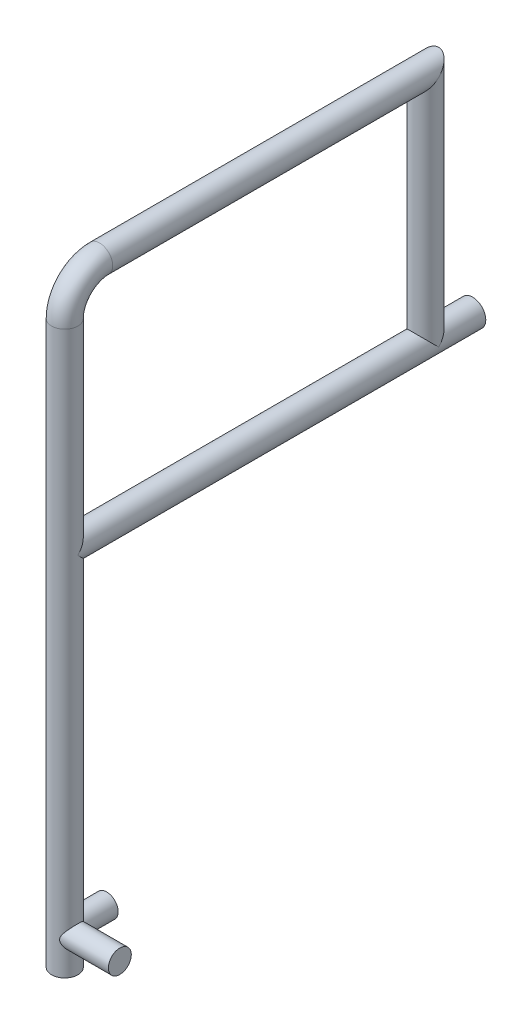
ISO-10303-21;
HEADER;
FILE_DESCRIPTION(('STEP AP214'),'2;1');
FILE_NAME('part.step','',(''),(''),'','','');
FILE_SCHEMA(('AUTOMOTIVE_DESIGN { 1 0 10303 214 1 1 1 1 }'));
ENDSEC;
DATA;
#1=APPLICATION_CONTEXT('core data for automotive mechanical design processes');
#2=APPLICATION_PROTOCOL_DEFINITION('international standard','automotive_design',2000,#1);
#3=PRODUCT_CONTEXT('',#1,'mechanical');
#4=PRODUCT('Part','Part','',(#3));
#5=PRODUCT_RELATED_PRODUCT_CATEGORY('part','',(#4));
#6=PRODUCT_DEFINITION_FORMATION('','',#4);
#7=PRODUCT_DEFINITION_CONTEXT('part definition',#1,'design');
#8=PRODUCT_DEFINITION('design','',#6,#7);
#9=PRODUCT_DEFINITION_SHAPE('','',#8);
#10=(LENGTH_UNIT() NAMED_UNIT(*) SI_UNIT(.MILLI.,.METRE.));
#11=(NAMED_UNIT(*) PLANE_ANGLE_UNIT() SI_UNIT($,.RADIAN.));
#12=(NAMED_UNIT(*) SI_UNIT($,.STERADIAN.) SOLID_ANGLE_UNIT());
#13=UNCERTAINTY_MEASURE_WITH_UNIT(LENGTH_MEASURE(1.E-05),#10,'distance_accuracy_value','');
#14=(GEOMETRIC_REPRESENTATION_CONTEXT(3) GLOBAL_UNCERTAINTY_ASSIGNED_CONTEXT((#13)) GLOBAL_UNIT_ASSIGNED_CONTEXT((#10,
#11,#12)) REPRESENTATION_CONTEXT('',''));
#15=CARTESIAN_POINT('',(0.,0.,0.));
#16=DIRECTION('',(0.,0.,1.));
#17=DIRECTION('',(1.,0.,0.));
#18=AXIS2_PLACEMENT_3D('',#15,#16,#17);
#19=CARTESIAN_POINT('',(0.,0.,0.));
#20=DIRECTION('',(0.,1.,0.));
#21=DIRECTION('',(0.,0.,1.));
#22=AXIS2_PLACEMENT_3D('',#19,#20,#21);
#23=CYLINDRICAL_SURFACE('',#22,20.);
#24=CARTESIAN_POINT('',(0.,0.,0.));
#25=DIRECTION('',(0.,0.707106781186547,0.707106781186547));
#26=DIRECTION('',(0.,0.707106781186547,-0.707106781186547));
#27=AXIS2_PLACEMENT_3D('',#24,#25,#26);
#28=ELLIPSE('',#27,28.2842712474619,20.);
#29=CARTESIAN_POINT('',(-20.,0.,0.));
#30=VERTEX_POINT('',#29);
#31=CARTESIAN_POINT('',(20.,0.,0.));
#32=VERTEX_POINT('',#31);
#33=EDGE_CURVE('E93',#30,#32,#28,.F.);
#34=ORIENTED_EDGE('',*,*,#33,.F.);
#35=CARTESIAN_POINT('',(0.,0.,0.));
#36=DIRECTION('',(0.,0.707106781186547,-0.707106781186547));
#37=DIRECTION('',(0.,0.707106781186547,0.707106781186547));
#38=AXIS2_PLACEMENT_3D('',#35,#36,#37);
#39=ELLIPSE('',#38,28.2842712474619,20.);
#40=EDGE_CURVE('E96',#32,#30,#39,.T.);
#41=ORIENTED_EDGE('',*,*,#40,.F.);
#42=EDGE_LOOP('',(#34,#41));
#43=FACE_BOUND('',#42,.T.);
#44=CARTESIAN_POINT('',(0.,302.819820908144,0.));
#45=DIRECTION('',(0.,1.,0.));
#46=DIRECTION('',(0.,0.,1.));
#47=AXIS2_PLACEMENT_3D('',#44,#45,#46);
#48=CIRCLE('',#47,20.);
#49=CARTESIAN_POINT('',(0.,302.819820908144,20.));
#50=VERTEX_POINT('',#49);
#51=EDGE_CURVE('E163',#50,#50,#48,.T.);
#52=ORIENTED_EDGE('',*,*,#51,.F.);
#53=EDGE_LOOP('',(#52));
#54=FACE_BOUND('',#53,.T.);
#55=CARTESIAN_POINT('',(0.,-553.90605298,0.));
#56=DIRECTION('',(0.,-1.,0.));
#57=DIRECTION('',(0.,0.,-1.));
#58=AXIS2_PLACEMENT_3D('',#55,#56,#57);
#59=CIRCLE('',#58,20.);
#60=CARTESIAN_POINT('',(0.,-553.90605298,-20.));
#61=VERTEX_POINT('',#60);
#62=EDGE_CURVE('E148',#61,#61,#59,.T.);
#63=ORIENTED_EDGE('',*,*,#62,.F.);
#64=EDGE_LOOP('',(#63));
#65=FACE_BOUND('',#64,.T.);
#66=CARTESIAN_POINT('',(17.5,-503.90605298,-9.68245836551851));
#67=CARTESIAN_POINT('',(17.4999987045085,-504.187638009203,-9.68246231795956));
#68=CARTESIAN_POINT('',(17.493183750782,-504.469242415254,-9.69480918943083));
#69=CARTESIAN_POINT('',(17.4661432014171,-505.029712400521,-9.74343813489293));
#70=CARTESIAN_POINT('',(17.4459158352374,-505.308577613209,-9.77972336892797));
#71=CARTESIAN_POINT('',(17.3925802335263,-505.86197922257,-9.87426328854647));
#72=CARTESIAN_POINT('',(17.3594395524864,-506.136502888467,-9.93257330136767));
#73=CARTESIAN_POINT('',(17.2810764516704,-506.679066974342,-10.0682929552098));
#74=CARTESIAN_POINT('',(17.2358485846765,-506.947104411692,-10.1457112063541));
#75=CARTESIAN_POINT('',(17.111615833226,-507.592997294864,-10.3543761638166));
#76=CARTESIAN_POINT('',(17.0265244282843,-507.966884340313,-10.4942738051237));
#77=CARTESIAN_POINT('',(16.835147722142,-508.698873939867,-10.7986160705714));
#78=CARTESIAN_POINT('',(16.7288502054552,-509.05696725036,-10.9630748290121));
#79=CARTESIAN_POINT('',(16.4963517580476,-509.759045089837,-11.3099122851878));
#80=CARTESIAN_POINT('',(16.3700907398646,-510.102982941877,-11.4923444346771));
#81=CARTESIAN_POINT('',(16.0989927963247,-510.776586977339,-11.8691327091975));
#82=CARTESIAN_POINT('',(15.9541574184724,-511.106254346635,-12.0634878401741));
#83=CARTESIAN_POINT('',(15.6780399234265,-511.686154489637,-12.4192960222625));
#84=CARTESIAN_POINT('',(15.5500516306426,-511.938834657242,-12.5793409858103));
#85=CARTESIAN_POINT('',(15.2829019251943,-512.43615073305,-12.902593301777));
#86=CARTESIAN_POINT('',(15.1437394001281,-512.680785836935,-13.0658009678149));
#87=CARTESIAN_POINT('',(14.7095234796256,-513.403209717864,-13.5580665641397));
#88=CARTESIAN_POINT('',(14.3978045379539,-513.869385708831,-13.8896847405041));
#89=CARTESIAN_POINT('',(13.7305135891895,-514.770531463886,-14.5496844312408));
#90=CARTESIAN_POINT('',(13.3749876608545,-515.205533269556,-14.878068960753));
#91=CARTESIAN_POINT('',(12.6194286054934,-516.043516244562,-15.5240744357728));
#92=CARTESIAN_POINT('',(12.2194155138144,-516.446511689313,-15.8417001432422));
#93=CARTESIAN_POINT('',(11.471973798996,-517.128659549576,-16.3876744815375));
#94=CARTESIAN_POINT('',(11.1337109016367,-517.41493070967,-16.619711347584));
#95=CARTESIAN_POINT('',(10.4305290731242,-517.964974479015,-17.0698056319617));
#96=CARTESIAN_POINT('',(10.0656108563211,-518.22874769079,-17.2878634246317));
#97=CARTESIAN_POINT('',(9.30998224050813,-518.73102357124,-17.7062273974091));
#98=CARTESIAN_POINT('',(8.91930810724848,-518.969560590409,-17.9065576451303));
#99=CARTESIAN_POINT('',(8.11259198784244,-519.418914990599,-18.2861816709093));
#100=CARTESIAN_POINT('',(7.69655515376659,-519.629737974048,-18.4654796998659));
#101=CARTESIAN_POINT('',(6.92084465035014,-519.983930199969,-18.7680937292759));
#102=CARTESIAN_POINT('',(6.56519415452404,-520.132539332453,-18.8956068534806));
#103=CARTESIAN_POINT('',(5.83953557962158,-520.407577264458,-19.1323128930905));
#104=CARTESIAN_POINT('',(5.46953046099664,-520.534010608058,-19.2415095615516));
#105=CARTESIAN_POINT('',(4.71701905550149,-520.762930860696,-19.4396771962977));
#106=CARTESIAN_POINT('',(4.33451712566121,-520.865426016367,-19.5286551275904));
#107=CARTESIAN_POINT('',(3.55916144167601,-521.044918001859,-19.6847333854609));
#108=CARTESIAN_POINT('',(3.16630757337979,-521.121914550378,-19.7518334706816));
#109=CARTESIAN_POINT('',(2.37089370722897,-521.249407349046,-19.8630552241249));
#110=CARTESIAN_POINT('',(1.96829309755167,-521.299759973523,-19.9070523449014));
#111=CARTESIAN_POINT('',(1.15863165139275,-521.372385309669,-19.9705396287186));
#112=CARTESIAN_POINT('',(0.751570804832553,-521.394657957872,-19.9900297363705));
#113=CARTESIAN_POINT('',(-0.0634815918557116,-521.410683537615,-20.0040514912821));
#114=CARTESIAN_POINT('',(-0.47147299360347,-521.404440736207,-19.9985868727677));
#115=CARTESIAN_POINT('',(-1.28491619288922,-521.36356740107,-19.9628332349748));
#116=CARTESIAN_POINT('',(-1.69036812413706,-521.328938374831,-19.9325455339593));
#117=CARTESIAN_POINT('',(-2.46102432415985,-521.236111694214,-19.8514602849103));
#118=CARTESIAN_POINT('',(-2.82671325593885,-521.18017473292,-19.8026311439351));
#119=CARTESIAN_POINT('',(-3.55079998638611,-521.045988309111,-19.6856876965186));
#120=CARTESIAN_POINT('',(-3.90919828968454,-520.967740396545,-19.6175747297336));
#121=CARTESIAN_POINT('',(-4.61671283842635,-520.79004039036,-19.4632241291767));
#122=CARTESIAN_POINT('',(-4.96582840116057,-520.690586741965,-19.3769851664396));
#123=CARTESIAN_POINT('',(-5.6530896935226,-520.471760274158,-19.187747148224));
#124=CARTESIAN_POINT('',(-5.99123474502797,-520.352386226193,-19.0847470590451));
#125=CARTESIAN_POINT('',(-6.677823281622,-520.086327834972,-18.8559373813998));
#126=CARTESIAN_POINT('',(-7.02540131475717,-519.938337706903,-18.7290524867205));
#127=CARTESIAN_POINT('',(-7.7053146665914,-519.62287858202,-18.4597362362002));
#128=CARTESIAN_POINT('',(-8.03764972078849,-519.455409247374,-18.3173046107311));
#129=CARTESIAN_POINT('',(-8.68638320773264,-519.102537449897,-18.0187205249017));
#130=CARTESIAN_POINT('',(-9.00277616640983,-518.917128890198,-17.8625634014241));
#131=CARTESIAN_POINT('',(-9.61903985229954,-518.529888376958,-17.5383965882111));
#132=CARTESIAN_POINT('',(-9.91890713869978,-518.328053024697,-17.3703844466224));
#133=CARTESIAN_POINT('',(-10.6524472151174,-517.801075409445,-16.934862683433));
#134=CARTESIAN_POINT('',(-11.0752167304358,-517.466097693799,-16.6607909760938));
#135=CARTESIAN_POINT('',(-11.8818982022432,-516.765146673167,-16.0954431497883));
#136=CARTESIAN_POINT('',(-12.2657920446022,-516.399159063661,-15.8041591099173));
#137=CARTESIAN_POINT('',(-12.9958240083844,-515.637949607916,-15.2095597193116));
#138=CARTESIAN_POINT('',(-13.3418605372674,-515.242653654606,-14.9062148361665));
#139=CARTESIAN_POINT('',(-13.9953365498953,-514.425290322128,-14.2944299438424));
#140=CARTESIAN_POINT('',(-14.3027862373239,-514.003230064983,-13.9859913061423));
#141=CARTESIAN_POINT('',(-14.8388897116663,-513.193614825029,-13.4141221200939));
#142=CARTESIAN_POINT('',(-15.0725463028033,-512.809531032022,-13.1504504526446));
#143=CARTESIAN_POINT('',(-15.5114180261909,-512.020833533775,-12.6297963642774));
#144=CARTESIAN_POINT('',(-15.7166252607194,-511.616214170145,-12.3728158168733));
#145=CARTESIAN_POINT('',(-16.0972148337802,-510.7862851887,-11.8734123320218));
#146=CARTESIAN_POINT('',(-16.2726794391511,-510.361036968866,-11.6309504806044));
#147=CARTESIAN_POINT('',(-16.5927788632844,-509.48691756489,-11.1695243163615));
#148=CARTESIAN_POINT('',(-16.7374405431509,-509.038067391895,-10.950539614174));
#149=CARTESIAN_POINT('',(-16.9333325052445,-508.330672621171,-10.6432351030576));
#150=CARTESIAN_POINT('',(-16.9966377344709,-508.081190694221,-10.5416678184595));
#151=CARTESIAN_POINT('',(-17.1130712677551,-507.5748780262,-10.3515787409943));
#152=CARTESIAN_POINT('',(-17.1661983295665,-507.318046392489,-10.2630585408289));
#153=CARTESIAN_POINT('',(-17.2614241472653,-506.797932264893,-10.1020785938894));
#154=CARTESIAN_POINT('',(-17.3035451687485,-506.534663991926,-10.0295864682285));
#155=CARTESIAN_POINT('',(-17.3760879435573,-506.002169182628,-9.90337736681871));
#156=CARTESIAN_POINT('',(-17.4065160016406,-505.732945940225,-9.84965027453365));
#157=CARTESIAN_POINT('',(-17.4552894705277,-505.186334195269,-9.76296098654505));
#158=CARTESIAN_POINT('',(-17.4734688604364,-504.90888472239,-9.7302843631978));
#159=CARTESIAN_POINT('',(-17.4965474138236,-504.351655489637,-9.68872595593486));
#160=CARTESIAN_POINT('',(-17.5014478969323,-504.07187596409,-9.67984180757338));
#161=CARTESIAN_POINT('',(-17.4978121429926,-503.512641200022,-9.68641226122004));
#162=CARTESIAN_POINT('',(-17.4892733865369,-503.233186032135,-9.7018714267845));
#163=CARTESIAN_POINT('',(-17.4590283498962,-502.677287535776,-9.75619132077277));
#164=CARTESIAN_POINT('',(-17.4373200245495,-502.400844681888,-9.79505568388823));
#165=CARTESIAN_POINT('',(-17.3778033249474,-501.818434768071,-9.90030505749485));
#166=CARTESIAN_POINT('',(-17.3383041208272,-501.513162538779,-9.9695521066519));
#167=CARTESIAN_POINT('',(-17.2445130686978,-500.911109415025,-10.1309144356563));
#168=CARTESIAN_POINT('',(-17.1902178019256,-500.614330500555,-10.2230350001972));
#169=CARTESIAN_POINT('',(-17.0678080717346,-500.029256488622,-10.426121477896));
#170=CARTESIAN_POINT('',(-16.9996516179019,-499.740990292605,-10.5371444826998));
#171=CARTESIAN_POINT('',(-16.8505942445724,-499.173877046099,-10.7739055865237));
#172=CARTESIAN_POINT('',(-16.7696878926591,-498.895034072398,-10.8996499520537));
#173=CARTESIAN_POINT('',(-16.6071825156515,-498.382086952647,-11.145416053778));
#174=CARTESIAN_POINT('',(-16.5270279124971,-498.146862731782,-11.2640727087571));
#175=CARTESIAN_POINT('',(-16.3580751079654,-497.683173317455,-11.508059368069));
#176=CARTESIAN_POINT('',(-16.2692786309489,-497.45470678741,-11.633388038846));
#177=CARTESIAN_POINT('',(-15.990206903609,-496.778541945638,-12.0172011374973));
#178=CARTESIAN_POINT('',(-15.7873351129922,-496.340346132694,-12.2833802803912));
#179=CARTESIAN_POINT('',(-15.3491681676133,-495.486824303244,-12.8267404765425));
#180=CARTESIAN_POINT('',(-15.1138270691918,-495.071531881387,-13.1039367160034));
#181=CARTESIAN_POINT('',(-14.6114321896762,-494.263318815564,-13.6618803280394));
#182=CARTESIAN_POINT('',(-14.3443866679908,-493.870392384259,-13.9426267587902));
#183=CARTESIAN_POINT('',(-13.7569296300854,-493.077453813111,-14.5234398651412));
#184=CARTESIAN_POINT('',(-13.4340017148748,-492.679185307141,-14.8233476898615));
#185=CARTESIAN_POINT('',(-12.7509309998255,-491.909025658326,-15.4148615624592));
#186=CARTESIAN_POINT('',(-12.390781361968,-491.53713938341,-15.7064660723356));
#187=CARTESIAN_POINT('',(-11.6337204129122,-490.822593099614,-16.2751429427536));
#188=CARTESIAN_POINT('',(-11.2368838937112,-490.47987625061,-16.5522431410083));
#189=CARTESIAN_POINT('',(-10.4058480823507,-489.826009453746,-17.0869029944245));
#190=CARTESIAN_POINT('',(-9.97166247275457,-489.514848036043,-17.3444697410039));
#191=CARTESIAN_POINT('',(-9.18304429114012,-489.003632974557,-17.7712631721111));
#192=CARTESIAN_POINT('',(-8.83683781863635,-488.795591906182,-17.9461673608625));
#193=CARTESIAN_POINT('',(-8.12480400602864,-488.401114225544,-18.2795514953357));
#194=CARTESIAN_POINT('',(-7.75898151834497,-488.21467230603,-18.4380354747462));
#195=CARTESIAN_POINT('',(-7.00880756318532,-487.865550544654,-18.7360469717586));
#196=CARTESIAN_POINT('',(-6.62446045355506,-487.702865150101,-18.8755789185479));
#197=CARTESIAN_POINT('',(-5.83876634816055,-487.403461845191,-19.1332092453521));
#198=CARTESIAN_POINT('',(-5.43741906400192,-487.266744375576,-19.2513072615778));
#199=CARTESIAN_POINT('',(-4.61635990334325,-487.020422475996,-19.4646008627409));
#200=CARTESIAN_POINT('',(-4.19651630384067,-486.911070362816,-19.5595831080311));
#201=CARTESIAN_POINT('',(-3.34489411006687,-486.723160751471,-19.7230737390982));
#202=CARTESIAN_POINT('',(-2.91311547263318,-486.64460336469,-19.79158202912));
#203=CARTESIAN_POINT('',(-2.04168403638292,-486.519992411348,-19.9003562197097));
#204=CARTESIAN_POINT('',(-1.60203727520828,-486.473914932689,-19.9406428972317));
#205=CARTESIAN_POINT('',(-0.718839505700273,-486.415225360157,-19.9919694764988));
#206=CARTESIAN_POINT('',(-0.275289047413629,-486.402608624942,-20.0030134345039));
#207=CARTESIAN_POINT('',(0.551522796600775,-486.410537062337,-19.9960767606155));
#208=CARTESIAN_POINT('',(0.934867074390424,-486.426849164909,-19.9818010524998));
#209=CARTESIAN_POINT('',(1.69819663461638,-486.484440536551,-19.9314420569356));
#210=CARTESIAN_POINT('',(2.0781822730498,-486.525717126528,-19.8953611095413));
#211=CARTESIAN_POINT('',(2.83208420729453,-486.632539362997,-19.8021108897347));
#212=CARTESIAN_POINT('',(3.20600043128526,-486.698085296455,-19.744941367967));
#213=CARTESIAN_POINT('',(3.94533820947784,-486.852404302861,-19.6105964335527));
#214=CARTESIAN_POINT('',(4.3107594077774,-486.941178347056,-19.5334201843569));
#215=CARTESIAN_POINT('',(5.02791317002266,-487.139796525061,-19.3611707540315));
#216=CARTESIAN_POINT('',(5.37973649046676,-487.24945270473,-19.2662573524069));
#217=CARTESIAN_POINT('',(6.071334908227,-487.488902880979,-19.0596211609535));
#218=CARTESIAN_POINT('',(6.41111046394941,-487.618696110351,-18.9478990115318));
#219=CARTESIAN_POINT('',(7.07745722468956,-487.896992993497,-18.7092190635449));
#220=CARTESIAN_POINT('',(7.40402541661725,-488.045500885329,-18.5822578142969));
#221=CARTESIAN_POINT('',(8.04301328355594,-488.359774680367,-18.3147474221613));
#222=CARTESIAN_POINT('',(8.35543003122139,-488.525544131089,-18.1741954866046));
#223=CARTESIAN_POINT('',(9.10397436245988,-488.951853016445,-17.8145907293151));
#224=CARTESIAN_POINT('',(9.53188835109631,-489.221255785161,-17.5888636641035));
#225=CARTESIAN_POINT('',(10.3554405658836,-489.789910108647,-17.1169593153222));
#226=CARTESIAN_POINT('',(10.7510661578432,-490.089173246706,-16.8707741019663));
#227=CARTESIAN_POINT('',(11.5104422744364,-490.715058983897,-16.3621198901789));
#228=CARTESIAN_POINT('',(11.8741247202074,-491.04173724824,-16.0996180560313));
#229=CARTESIAN_POINT('',(12.5687624660778,-491.719515113706,-15.5633771594029));
#230=CARTESIAN_POINT('',(12.8997218406325,-492.070611665131,-15.2896395019523));
#231=CARTESIAN_POINT('',(13.5356508566244,-492.803073109048,-14.72987316462));
#232=CARTESIAN_POINT('',(13.8399592593223,-493.184906651098,-14.4437078646564));
#233=CARTESIAN_POINT('',(14.4152330038578,-493.971834141318,-13.8696125016716));
#234=CARTESIAN_POINT('',(14.6861907790018,-494.376933337607,-13.5816820536672));
#235=CARTESIAN_POINT('',(15.1943805053081,-495.210149718194,-13.010637513981));
#236=CARTESIAN_POINT('',(15.4316500572476,-495.638240492993,-12.7275183680389));
#237=CARTESIAN_POINT('',(15.8721719066567,-496.519130386944,-12.1737010959011));
#238=CARTESIAN_POINT('',(16.0754421095446,-496.971916332954,-11.9029964865827));
#239=CARTESIAN_POINT('',(16.3687173904552,-497.709276540424,-11.49345720717));
#240=CARTESIAN_POINT('',(16.4705088954274,-497.98489421638,-11.3468698043643));
#241=CARTESIAN_POINT('',(16.6615061443608,-498.545829762428,-11.0645018507486));
#242=CARTESIAN_POINT('',(16.7507152785887,-498.831144993743,-10.9287183931755));
#243=CARTESIAN_POINT('',(16.9156795216673,-499.411537715271,-10.6716024645333));
#244=CARTESIAN_POINT('',(16.9914536680585,-499.706600677473,-10.5502496267717));
#245=CARTESIAN_POINT('',(17.1286628505161,-500.306938183144,-10.3259964141428));
#246=CARTESIAN_POINT('',(17.1901019079224,-500.612209835287,-10.2230908662448));
#247=CARTESIAN_POINT('',(17.2853099639157,-501.16242940612,-10.0610540433444));
#248=CARTESIAN_POINT('',(17.3221943738273,-501.40546889127,-9.9972840458887));
#249=CARTESIAN_POINT('',(17.3859968639091,-501.896486181039,-9.88591139744385));
#250=CARTESIAN_POINT('',(17.412918062394,-502.144462414889,-9.83830368832163));
#251=CARTESIAN_POINT('',(17.4562054479926,-502.64370143014,-9.76129389812739));
#252=CARTESIAN_POINT('',(17.4725911158864,-502.894957264168,-9.73185822000438));
#253=CARTESIAN_POINT('',(17.4944891931898,-503.399487778813,-9.69243828492371));
#254=CARTESIAN_POINT('',(17.5000011653163,-503.652762540209,-9.68245481023173));
#255=CARTESIAN_POINT('',(17.5,-503.90605298,-9.68245836551851));
#256=B_SPLINE_CURVE_WITH_KNOTS('',3,(#66,#67,#68,#69,#70,#71,#72,#73,#74,#75,#76,#77,#78,#79,
#80,#81,#82,#83,#84,#85,#86,#87,#88,#89,#90,#91,#92,#93,#94,#95,#96,#97,#98,#99,#100,#101,#102,
#103,#104,#105,#106,#107,#108,#109,#110,#111,#112,#113,#114,#115,#116,#117,#118,#119,#120,#121,
#122,#123,#124,#125,#126,#127,#128,#129,#130,#131,#132,#133,#134,#135,#136,#137,#138,#139,#140,
#141,#142,#143,#144,#145,#146,#147,#148,#149,#150,#151,#152,#153,#154,#155,#156,#157,#158,#159,
#160,#161,#162,#163,#164,#165,#166,#167,#168,#169,#170,#171,#172,#173,#174,#175,#176,#177,#178,
#179,#180,#181,#182,#183,#184,#185,#186,#187,#188,#189,#190,#191,#192,#193,#194,#195,#196,#197,
#198,#199,#200,#201,#202,#203,#204,#205,#206,#207,#208,#209,#210,#211,#212,#213,#214,#215,#216,
#217,#218,#219,#220,#221,#222,#223,#224,#225,#226,#227,#228,#229,#230,#231,#232,#233,#234,#235,
#236,#237,#238,#239,#240,#241,#242,#243,#244,#245,#246,#247,#248,#249,#250,#251,#252,#253,#254,
#255),.UNSPECIFIED.,.T.,.F.,(4,2,2,2,2,2,2,2,2,2,2,2,2,2,2,2,2,2,2,2,2,2,2,2,2,2,2,2,2,2,2,2,2,
2,2,2,2,2,2,2,2,2,2,2,2,2,2,2,2,2,2,2,2,2,2,2,2,2,2,2,2,2,2,2,2,2,2,2,2,2,2,2,2,2,2,2,2,2,2,2,2,
2,2,2,2,2,2,2,2,2,2,2,2,2,4),(0.,0.844447348855804,1.68900619343504,2.53570087187167,
3.38277776751629,4.60521386836723,5.82835618043759,7.05525263874213,8.28204694569044,
9.25773598830623,10.2335222820803,12.1855950795112,14.1356318252152,16.0847938770524,
17.5841768963533,19.0835197476246,20.5807947596339,22.0777666285752,23.2945832448506,
24.5111502290909,25.7272974894221,26.9434581658806,28.1661095116172,29.3887636206883,
30.6112347777573,31.8336410180615,32.95184546631,34.069972251428,35.1881810441921,
36.3064588258382,37.500847223771,38.6952563393504,39.8900728251208,41.085137151123,
42.8975713540968,44.7108462126302,46.5288735543442,48.3464191298368,49.9088676293691,
51.4717490096991,53.030234375123,54.5873550762648,55.416987035205,56.2467201863972,
57.0747615303507,57.9023557721026,58.7409531185224,59.5794671238206,60.4181383411355,
61.2569398328303,62.2019727672853,63.1472242454998,64.0953830575369,65.0439469543564,
65.8697638349125,66.6954162721954,68.3476501697795,70.0022464038743,71.6564125363883,
73.4366906864781,75.2172964755623,76.9943490678951,78.7707534002672,80.0900636738466,
81.409049081404,82.727725702949,84.046424703755,85.376868218913,86.707316546183,
88.0367843555127,89.3660677445915,90.5165163740823,91.6668415637832,92.8171803555992,
93.9675672547518,95.1080513760503,96.2484920563186,97.3891914624534,98.5301257642416,
100.188931696167,101.848383624288,103.511290533535,105.173990127436,106.870326993518,
108.567048023084,110.261860131013,111.955776853396,112.940377948194,113.924713237479,
114.907642366028,115.890295426722,116.651508996311,117.412484117202,118.172048075373,
118.931642578596),.UNSPECIFIED.);
#257=CARTESIAN_POINT('',(14.1421356237309,-514.213817044044,-14.142135623731));
#258=VERTEX_POINT('',#257);
#259=CARTESIAN_POINT('',(14.142135623731,-493.598288915956,-14.1421356237309));
#260=VERTEX_POINT('',#259);
#261=EDGE_CURVE('E49',#258,#260,#256,.T.);
#262=ORIENTED_EDGE('',*,*,#261,.F.);
#263=CARTESIAN_POINT('',(9.68245836551853,-503.90605298,17.5));
#264=CARTESIAN_POINT('',(9.68246231795958,-503.624467950797,17.4999987045085));
#265=CARTESIAN_POINT('',(9.69480918943084,-503.342863544746,17.493183750782));
#266=CARTESIAN_POINT('',(9.74343813489293,-502.782393559479,17.4661432014171));
#267=CARTESIAN_POINT('',(9.77972336892798,-502.503528346791,17.4459158352374));
#268=CARTESIAN_POINT('',(9.87426328854648,-501.95012673743,17.3925802335263));
#269=CARTESIAN_POINT('',(9.93257330136768,-501.675603071533,17.3594395524864));
#270=CARTESIAN_POINT('',(10.0682929552098,-501.133038985658,17.2810764516704));
#271=CARTESIAN_POINT('',(10.1457112063541,-500.865001548308,17.2358485846765));
#272=CARTESIAN_POINT('',(10.3543761638166,-500.219108665137,17.111615833226));
#273=CARTESIAN_POINT('',(10.4942738051236,-499.845221619687,17.0265244282843));
#274=CARTESIAN_POINT('',(10.7986160705713,-499.113232020133,16.8351477221421));
#275=CARTESIAN_POINT('',(10.9630748290121,-498.75513870964,16.7288502054552));
#276=CARTESIAN_POINT('',(11.3099122851878,-498.053060870163,16.4963517580476));
#277=CARTESIAN_POINT('',(11.492344434677,-497.709123018124,16.3700907398647));
#278=CARTESIAN_POINT('',(11.8691327091973,-497.035518982662,16.0989927963248));
#279=CARTESIAN_POINT('',(12.0634878401739,-496.705851613365,15.9541574184725));
#280=CARTESIAN_POINT('',(12.4192960222624,-496.125951470364,15.6780399234266));
#281=CARTESIAN_POINT('',(12.5793409858102,-495.873271302758,15.5500516306427));
#282=CARTESIAN_POINT('',(12.9025933017769,-495.375955226951,15.2829019251944));
#283=CARTESIAN_POINT('',(13.0658009678148,-495.131320123066,15.1437394001282));
#284=CARTESIAN_POINT('',(13.5580665641396,-494.408896242136,14.7095234796257));
#285=CARTESIAN_POINT('',(13.8896847405039,-493.942720251169,14.397804537954));
#286=CARTESIAN_POINT('',(14.5496844312406,-493.041574496114,13.7305135891896));
#287=CARTESIAN_POINT('',(14.8780689607529,-492.606572690444,13.3749876608546));
#288=CARTESIAN_POINT('',(15.5240744357727,-491.768589715438,12.6194286054936));
#289=CARTESIAN_POINT('',(15.841700143242,-491.365594270688,12.2194155138146));
#290=CARTESIAN_POINT('',(16.3876744815374,-490.683446410424,11.4719737989962));
#291=CARTESIAN_POINT('',(16.6197113475839,-490.39717525033,11.1337109016369));
#292=CARTESIAN_POINT('',(17.0698056319616,-489.847131480985,10.4305290731243));
#293=CARTESIAN_POINT('',(17.2878634246316,-489.58335826921,10.0656108563212));
#294=CARTESIAN_POINT('',(17.706227397409,-489.081082388761,9.30998224050825));
#295=CARTESIAN_POINT('',(17.9065576451303,-488.842545369591,8.91930810724858));
#296=CARTESIAN_POINT('',(18.2861816709093,-488.393190969401,8.11259198784256));
#297=CARTESIAN_POINT('',(18.4654796998659,-488.182367985952,7.69655515376677));
#298=CARTESIAN_POINT('',(18.7680937292758,-487.828175760031,6.92084465035035));
#299=CARTESIAN_POINT('',(18.8956068534805,-487.679566627547,6.56519415452423));
#300=CARTESIAN_POINT('',(19.1323128930904,-487.404528695542,5.83953557962178));
#301=CARTESIAN_POINT('',(19.2415095615515,-487.278095351942,5.46953046099684));
#302=CARTESIAN_POINT('',(19.4396771962977,-487.049175099304,4.71701905550169));
#303=CARTESIAN_POINT('',(19.5286551275903,-486.946679943633,4.33451712566139));
#304=CARTESIAN_POINT('',(19.6847333854608,-486.767187958141,3.55916144167619));
#305=CARTESIAN_POINT('',(19.7518334706815,-486.690191409622,3.16630757337999));
#306=CARTESIAN_POINT('',(19.8630552241249,-486.562698610954,2.3708937072292));
#307=CARTESIAN_POINT('',(19.9070523449014,-486.512345986477,1.96829309755189));
#308=CARTESIAN_POINT('',(19.9705396287186,-486.439720650331,1.15863165139297));
#309=CARTESIAN_POINT('',(19.9900297363705,-486.417448002128,0.751570804832781));
#310=CARTESIAN_POINT('',(20.0040514912821,-486.401422422385,-0.0634815918554822));
#311=CARTESIAN_POINT('',(19.9985868727677,-486.407665223793,-0.471472993603242));
#312=CARTESIAN_POINT('',(19.9628332349748,-486.44853855893,-1.28491619288899));
#313=CARTESIAN_POINT('',(19.9325455339593,-486.483167585169,-1.69036812413683));
#314=CARTESIAN_POINT('',(19.8514602849104,-486.575994265786,-2.46102432415962));
#315=CARTESIAN_POINT('',(19.8026311439351,-486.63193122708,-2.82671325593862));
#316=CARTESIAN_POINT('',(19.6856876965186,-486.766117650889,-3.55079998638588));
#317=CARTESIAN_POINT('',(19.6175747297336,-486.844365563455,-3.90919828968431));
#318=CARTESIAN_POINT('',(19.4632241291768,-487.02206556964,-4.61671283842615));
#319=CARTESIAN_POINT('',(19.3769851664396,-487.121519218035,-4.96582840116039));
#320=CARTESIAN_POINT('',(19.1877471482241,-487.340345685842,-5.65308969352242));
#321=CARTESIAN_POINT('',(19.0847470590452,-487.459719733807,-5.99123474502777));
#322=CARTESIAN_POINT('',(18.8559373813998,-487.725778125028,-6.67782328162176));
#323=CARTESIAN_POINT('',(18.7290524867206,-487.873768253097,-7.02540131475693));
#324=CARTESIAN_POINT('',(18.4597362362003,-488.18922737798,-7.70531466659115));
#325=CARTESIAN_POINT('',(18.3173046107312,-488.356696712626,-8.03764972078823));
#326=CARTESIAN_POINT('',(18.0187205249019,-488.709568510103,-8.68638320773236));
#327=CARTESIAN_POINT('',(17.8625634014243,-488.894977069802,-9.00277616640954));
#328=CARTESIAN_POINT('',(17.5383965882113,-489.282217583042,-9.61903985229929));
#329=CARTESIAN_POINT('',(17.3703844466225,-489.484052935303,-9.91890713869957));
#330=CARTESIAN_POINT('',(16.9348626834331,-490.011030550554,-10.6524472151172));
#331=CARTESIAN_POINT('',(16.660790976094,-490.3460082662,-11.0752167304356));
#332=CARTESIAN_POINT('',(16.0954431497885,-491.046959286833,-11.8818982022429));
#333=CARTESIAN_POINT('',(15.8041591099174,-491.412946896339,-12.265792044602));
#334=CARTESIAN_POINT('',(15.2095597193118,-492.174156352084,-12.9958240083842));
#335=CARTESIAN_POINT('',(14.9062148361667,-492.569452305393,-13.3418605372672));
#336=CARTESIAN_POINT('',(14.2944299438426,-493.386815637872,-13.9953365498951));
#337=CARTESIAN_POINT('',(13.9859913061425,-493.808875895016,-14.3027862373237));
#338=CARTESIAN_POINT('',(13.414122120094,-494.618491134971,-14.8388897116662));
#339=CARTESIAN_POINT('',(13.1504504526447,-495.002574927978,-15.0725463028031));
#340=CARTESIAN_POINT('',(12.6297963642775,-495.791272426225,-15.5114180261908));
#341=CARTESIAN_POINT('',(12.3728158168734,-496.195891789855,-15.7166252607194));
#342=CARTESIAN_POINT('',(11.8734123320219,-497.0258207713,-16.0972148337801));
#343=CARTESIAN_POINT('',(11.6309504806045,-497.451068991134,-16.2726794391511));
#344=CARTESIAN_POINT('',(11.1695243163615,-498.32518839511,-16.5927788632844));
#345=CARTESIAN_POINT('',(10.950539614174,-498.774038568105,-16.7374405431509));
#346=CARTESIAN_POINT('',(10.6432351030576,-499.481433338829,-16.9333325052445));
#347=CARTESIAN_POINT('',(10.5416678184595,-499.73091526578,-16.9966377344709));
#348=CARTESIAN_POINT('',(10.3515787409943,-500.2372279338,-17.1130712677552));
#349=CARTESIAN_POINT('',(10.2630585408289,-500.494059567511,-17.1661983295666));
#350=CARTESIAN_POINT('',(10.1020785938894,-501.014173695107,-17.2614241472653));
#351=CARTESIAN_POINT('',(10.0295864682285,-501.277441968074,-17.3035451687485));
#352=CARTESIAN_POINT('',(9.90337736681871,-501.809936777372,-17.3760879435573));
#353=CARTESIAN_POINT('',(9.84965027453365,-502.079160019775,-17.4065160016406));
#354=CARTESIAN_POINT('',(9.76296098654506,-502.625771764731,-17.4552894705277));
#355=CARTESIAN_POINT('',(9.73028436319781,-502.90322123761,-17.4734688604364));
#356=CARTESIAN_POINT('',(9.68872595593487,-503.460450470363,-17.4965474138236));
#357=CARTESIAN_POINT('',(9.67984180757339,-503.74022999591,-17.5014478969323));
#358=CARTESIAN_POINT('',(9.68641226122005,-504.299464759978,-17.4978121429925));
#359=CARTESIAN_POINT('',(9.7018714267845,-504.578919927865,-17.4892733865369));
#360=CARTESIAN_POINT('',(9.75619132077276,-505.134818424224,-17.4590283498962));
#361=CARTESIAN_POINT('',(9.79505568388822,-505.411261278112,-17.4373200245495));
#362=CARTESIAN_POINT('',(9.90030505749485,-505.993671191929,-17.3778033249474));
#363=CARTESIAN_POINT('',(9.96955210665188,-506.298943421221,-17.3383041208272));
#364=CARTESIAN_POINT('',(10.1309144356563,-506.900996544975,-17.2445130686978));
#365=CARTESIAN_POINT('',(10.2230350001971,-507.197775459445,-17.1902178019256));
#366=CARTESIAN_POINT('',(10.4261214778959,-507.782849471378,-17.0678080717346));
#367=CARTESIAN_POINT('',(10.5371444826997,-508.071115667395,-16.9996516179019));
#368=CARTESIAN_POINT('',(10.7739055865237,-508.638228913901,-16.8505942445724));
#369=CARTESIAN_POINT('',(10.8996499520537,-508.917071887602,-16.7696878926591));
#370=CARTESIAN_POINT('',(11.145416053778,-509.430019007353,-16.6071825156515));
#371=CARTESIAN_POINT('',(11.2640727087571,-509.665243228218,-16.5270279124971));
#372=CARTESIAN_POINT('',(11.508059368069,-510.128932642545,-16.3580751079654));
#373=CARTESIAN_POINT('',(11.633388038846,-510.35739917259,-16.2692786309489));
#374=CARTESIAN_POINT('',(12.0172011374973,-511.033564014362,-15.990206903609));
#375=CARTESIAN_POINT('',(12.2833802803912,-511.471759827306,-15.7873351129922));
#376=CARTESIAN_POINT('',(12.8267404765425,-512.325281656756,-15.3491681676132));
#377=CARTESIAN_POINT('',(13.1039367160034,-512.740574078613,-15.1138270691918));
#378=CARTESIAN_POINT('',(13.6618803280395,-513.548787144436,-14.6114321896762));
#379=CARTESIAN_POINT('',(13.9426267587902,-513.941713575741,-14.3443866679908));
#380=CARTESIAN_POINT('',(14.5234398651412,-514.734652146889,-13.7569296300855));
#381=CARTESIAN_POINT('',(14.8233476898614,-515.132920652859,-13.4340017148748));
#382=CARTESIAN_POINT('',(15.4148615624592,-515.903080301674,-12.7509309998255));
#383=CARTESIAN_POINT('',(15.7064660723356,-516.27496657659,-12.390781361968));
#384=CARTESIAN_POINT('',(16.2751429427536,-516.989512860386,-11.6337204129122));
#385=CARTESIAN_POINT('',(16.5522431410083,-517.33222970939,-11.2368838937112));
#386=CARTESIAN_POINT('',(17.0869029944245,-517.986096506254,-10.4058480823507));
#387=CARTESIAN_POINT('',(17.344469741004,-518.297257923957,-9.97166247275453));
#388=CARTESIAN_POINT('',(17.7712631721112,-518.808472985443,-9.18304429114005));
#389=CARTESIAN_POINT('',(17.9461673608626,-519.016514053818,-8.83683781863627));
#390=CARTESIAN_POINT('',(18.2795514953357,-519.410991734456,-8.12480400602856));
#391=CARTESIAN_POINT('',(18.4380354747463,-519.59743365397,-7.75898151834492));
#392=CARTESIAN_POINT('',(18.7360469717586,-519.946555415346,-7.0088075631853));
#393=CARTESIAN_POINT('',(18.8755789185479,-520.109240809899,-6.62446045355504));
#394=CARTESIAN_POINT('',(19.1332092453521,-520.408644114809,-5.83876634816052));
#395=CARTESIAN_POINT('',(19.2513072615778,-520.545361584424,-5.43741906400189));
#396=CARTESIAN_POINT('',(19.4646008627409,-520.791683484004,-4.61635990334324));
#397=CARTESIAN_POINT('',(19.5595831080311,-520.901035597184,-4.19651630384068));
#398=CARTESIAN_POINT('',(19.7230737390982,-521.088945208529,-3.34489411006689));
#399=CARTESIAN_POINT('',(19.79158202912,-521.16750259531,-2.91311547263319));
#400=CARTESIAN_POINT('',(19.9003562197097,-521.292113548652,-2.04168403638294));
#401=CARTESIAN_POINT('',(19.9406428972317,-521.338191027311,-1.60203727520831));
#402=CARTESIAN_POINT('',(19.9919694764988,-521.396880599843,-0.718839505700305));
#403=CARTESIAN_POINT('',(20.0030134345039,-521.409497335058,-0.275289047413661));
#404=CARTESIAN_POINT('',(19.9960767606155,-521.401568897663,0.551522796600757));
#405=CARTESIAN_POINT('',(19.9818010524998,-521.385256795091,0.934867074390419));
#406=CARTESIAN_POINT('',(19.9314420569356,-521.327665423449,1.69819663461637));
#407=CARTESIAN_POINT('',(19.8953611095413,-521.286388833472,2.07818227304978));
#408=CARTESIAN_POINT('',(19.8021108897347,-521.179566597002,2.8320842072945));
#409=CARTESIAN_POINT('',(19.744941367967,-521.114020663545,3.20600043128525));
#410=CARTESIAN_POINT('',(19.6105964335527,-520.959701657139,3.94533820947782));
#411=CARTESIAN_POINT('',(19.5334201843569,-520.870927612944,4.31075940777736));
#412=CARTESIAN_POINT('',(19.3611707540315,-520.672309434939,5.02791317002261));
#413=CARTESIAN_POINT('',(19.2662573524069,-520.56265325527,5.37973649046672));
#414=CARTESIAN_POINT('',(19.0596211609535,-520.323203079021,6.07133490822696));
#415=CARTESIAN_POINT('',(18.9478990115318,-520.193409849649,6.41111046394937));
#416=CARTESIAN_POINT('',(18.7092190635449,-519.915112966503,7.07745722468953));
#417=CARTESIAN_POINT('',(18.5822578142969,-519.766605074671,7.40402541661722));
#418=CARTESIAN_POINT('',(18.3147474221613,-519.452331279633,8.04301328355591));
#419=CARTESIAN_POINT('',(18.1741954866046,-519.286561828911,8.35543003122136));
#420=CARTESIAN_POINT('',(17.8145907293151,-518.860252943555,9.10397436245986));
#421=CARTESIAN_POINT('',(17.5888636641035,-518.590850174839,9.5318883510963));
#422=CARTESIAN_POINT('',(17.1169593153222,-518.022195851353,10.3554405658836));
#423=CARTESIAN_POINT('',(16.8707741019663,-517.722932713294,10.7510661578432));
#424=CARTESIAN_POINT('',(16.3621198901789,-517.097046976103,11.5104422744364));
#425=CARTESIAN_POINT('',(16.0996180560314,-516.77036871176,11.8741247202074));
#426=CARTESIAN_POINT('',(15.5633771594029,-516.092590846294,12.5687624660778));
#427=CARTESIAN_POINT('',(15.2896395019523,-515.741494294869,12.8997218406325));
#428=CARTESIAN_POINT('',(14.72987316462,-515.009032850953,13.5356508566244));
#429=CARTESIAN_POINT('',(14.4437078646565,-514.627199308902,13.8399592593222));
#430=CARTESIAN_POINT('',(13.8696125016716,-513.840271818682,14.4152330038577));
#431=CARTESIAN_POINT('',(13.5816820536672,-513.435172622393,14.6861907790018));
#432=CARTESIAN_POINT('',(13.010637513981,-512.601956241807,15.194380505308));
#433=CARTESIAN_POINT('',(12.7275183680389,-512.173865467007,15.4316500572476));
#434=CARTESIAN_POINT('',(12.1737010959011,-511.292975573056,15.8721719066567));
#435=CARTESIAN_POINT('',(11.9029964865828,-510.840189627046,16.0754421095445));
#436=CARTESIAN_POINT('',(11.49345720717,-510.102829419577,16.3687173904552));
#437=CARTESIAN_POINT('',(11.3468698043644,-509.82721174362,16.4705088954273));
#438=CARTESIAN_POINT('',(11.0645018507486,-509.266276197572,16.6615061443607));
#439=CARTESIAN_POINT('',(10.9287183931755,-508.980960966257,16.7507152785887));
#440=CARTESIAN_POINT('',(10.6716024645333,-508.40056824473,16.9156795216673));
#441=CARTESIAN_POINT('',(10.5502496267718,-508.105505282528,16.9914536680584));
#442=CARTESIAN_POINT('',(10.3259964141429,-507.505167776857,17.128662850516));
#443=CARTESIAN_POINT('',(10.2230908662449,-507.199896124713,17.1901019079224));
#444=CARTESIAN_POINT('',(10.0610540433444,-506.64967655388,17.2853099639157));
#445=CARTESIAN_POINT('',(9.9972840458887,-506.406637068729,17.3221943738273));
#446=CARTESIAN_POINT('',(9.88591139744384,-505.915619778961,17.3859968639091));
#447=CARTESIAN_POINT('',(9.83830368832161,-505.667643545111,17.412918062394));
#448=CARTESIAN_POINT('',(9.76129389812738,-505.16840452986,17.4562054479926));
#449=CARTESIAN_POINT('',(9.73185822000437,-504.917148695832,17.4725911158864));
#450=CARTESIAN_POINT('',(9.69243828492371,-504.412618181187,17.4944891931898));
#451=CARTESIAN_POINT('',(9.68245481023175,-504.159343419791,17.5000011653163));
#452=CARTESIAN_POINT('',(9.68245836551853,-503.90605298,17.5));
#453=B_SPLINE_CURVE_WITH_KNOTS('',3,(#263,#264,#265,#266,#267,#268,#269,#270,#271,#272,#273,
#274,#275,#276,#277,#278,#279,#280,#281,#282,#283,#284,#285,#286,#287,#288,#289,#290,#291,#292,
#293,#294,#295,#296,#297,#298,#299,#300,#301,#302,#303,#304,#305,#306,#307,#308,#309,#310,#311,
#312,#313,#314,#315,#316,#317,#318,#319,#320,#321,#322,#323,#324,#325,#326,#327,#328,#329,#330,
#331,#332,#333,#334,#335,#336,#337,#338,#339,#340,#341,#342,#343,#344,#345,#346,#347,#348,#349,
#350,#351,#352,#353,#354,#355,#356,#357,#358,#359,#360,#361,#362,#363,#364,#365,#366,#367,#368,
#369,#370,#371,#372,#373,#374,#375,#376,#377,#378,#379,#380,#381,#382,#383,#384,#385,#386,#387,
#388,#389,#390,#391,#392,#393,#394,#395,#396,#397,#398,#399,#400,#401,#402,#403,#404,#405,#406,
#407,#408,#409,#410,#411,#412,#413,#414,#415,#416,#417,#418,#419,#420,#421,#422,#423,#424,#425,
#426,#427,#428,#429,#430,#431,#432,#433,#434,#435,#436,#437,#438,#439,#440,#441,#442,#443,#444,
#445,#446,#447,#448,#449,#450,#451,#452),.UNSPECIFIED.,.T.,.F.,(4,2,2,2,2,2,2,2,2,2,2,2,2,2,2,2,
2,2,2,2,2,2,2,2,2,2,2,2,2,2,2,2,2,2,2,2,2,2,2,2,2,2,2,2,2,2,2,2,2,2,2,2,2,2,2,2,2,2,2,2,2,2,2,2,
2,2,2,2,2,2,2,2,2,2,2,2,2,2,2,2,2,2,2,2,2,2,2,2,2,2,2,2,2,2,4),(0.,0.844447348855803,
1.68900619343504,2.53570087187167,3.38277776751629,4.60521386836704,5.82835618043747,
7.05525263874175,8.28204694569021,9.25773598830608,10.23352228208,12.1855950795109,
14.135631825215,16.0847938770521,17.5841768963531,19.0835197476245,20.5807947596338,
22.077766628575,23.2945832448503,24.5111502290907,25.7272974894219,26.9434581658804,
28.166109511617,29.388763620688,30.611234777757,31.8336410180613,32.9518454663098,
34.0699722514277,35.1881810441919,36.3064588258381,37.5008472237707,38.69525633935,
39.8900728251204,41.0851371511227,42.8975713540964,44.7108462126299,46.5288735543438,
48.3464191298364,49.9088676293688,51.4717490096989,53.0302343751229,54.5873550762649,
55.4169870352051,56.2467201863973,57.0747615303507,57.9023557721026,58.7409531185223,
59.5794671238206,60.4181383411352,61.2569398328303,62.2019727672851,63.1472242454995,
64.0953830575368,65.0439469543564,65.8697638349125,66.6954162721953,68.3476501697795,
70.0022464038743,71.6564125363882,73.4366906864781,75.2172964755622,76.9943490678951,
78.7707534002672,80.0900636738467,81.409049081404,82.727725702949,84.0464247037549,
85.3768682189129,86.7073165461829,88.0367843555126,89.3660677445914,90.5165163740823,
91.6668415637831,92.8171803555991,93.9675672547517,95.1080513760501,96.2484920563184,
97.3891914624533,98.5301257642415,100.188931696167,101.848383624288,103.511290533535,
105.173990127436,106.870326993517,108.567048023084,110.261860131013,111.955776853396,
112.940377948194,113.924713237479,114.907642366028,115.890295426721,116.651508996311,
117.412484117202,118.172048075373,118.931642578595),.UNSPECIFIED.);
#454=EDGE_CURVE('E55',#258,#260,#453,.T.);
#455=ORIENTED_EDGE('',*,*,#454,.T.);
#456=EDGE_LOOP('',(#262,#455));
#457=FACE_BOUND('',#456,.T.);
#458=ADVANCED_FACE('F39',(#43,#54,#65,#457),#23,.T.);
#459=CARTESIAN_POINT('',(0.,-503.90605298,-63.9999999999996));
#460=DIRECTION('',(0.,0.,1.));
#461=DIRECTION('',(1.,0.,0.));
#462=AXIS2_PLACEMENT_3D('',#459,#460,#461);
#463=CYLINDRICAL_SURFACE('',#462,17.5);
#464=CARTESIAN_POINT('',(0.,-503.90605298,-63.9999999999996));
#465=DIRECTION('',(0.,0.,1.));
#466=DIRECTION('',(1.,0.,0.));
#467=AXIS2_PLACEMENT_3D('',#464,#465,#466);
#468=CIRCLE('',#467,17.5);
#469=CARTESIAN_POINT('',(17.5,-503.90605298,-63.9999999999996));
#470=VERTEX_POINT('',#469);
#471=EDGE_CURVE('E88',#470,#470,#468,.T.);
#472=ORIENTED_EDGE('',*,*,#471,.T.);
#473=EDGE_LOOP('',(#472));
#474=FACE_BOUND('',#473,.T.);
#475=ORIENTED_EDGE('',*,*,#261,.T.);
#476=CARTESIAN_POINT('',(0.,-503.90605298,0.));
#477=DIRECTION('',(0.707106781186547,0.,0.707106781186548));
#478=DIRECTION('',(-0.707106781186547,0.,0.707106781186548));
#479=AXIS2_PLACEMENT_3D('',#476,#477,#478);
#480=ELLIPSE('',#479,24.7487373415292,17.5);
#481=EDGE_CURVE('E11',#260,#258,#480,.F.);
#482=ORIENTED_EDGE('',*,*,#481,.T.);
#483=EDGE_LOOP('',(#475,#482));
#484=FACE_BOUND('',#483,.T.);
#485=ADVANCED_FACE('F91',(#474,#484),#463,.T.);
#486=CARTESIAN_POINT('',(0.,378.064321521951,-550.094321521951));
#487=DIRECTION('',(0.,-1.,0.));
#488=DIRECTION('',(0.,0.,-1.));
#489=AXIS2_PLACEMENT_3D('',#486,#487,#488);
#490=CYLINDRICAL_SURFACE('',#489,20.);
#491=CARTESIAN_POINT('',(0.,0.,-550.094321521951));
#492=DIRECTION('',(0.,-0.707106781186548,0.707106781186547));
#493=DIRECTION('',(0.,-0.707106781186547,-0.707106781186548));
#494=AXIS2_PLACEMENT_3D('',#491,#492,#493);
#495=ELLIPSE('',#494,28.2842712474619,20.);
#496=CARTESIAN_POINT('',(19.9997775850257,0.0943215219507132,-550.));
#497=VERTEX_POINT('',#496);
#498=CARTESIAN_POINT('',(-19.9997775850257,0.0943215219507132,-550.));
#499=VERTEX_POINT('',#498);
#500=EDGE_CURVE('E158',#497,#499,#495,.T.);
#501=ORIENTED_EDGE('',*,*,#500,.F.);
#502=DIRECTION('',(0.,0.,1.));
#503=VECTOR('',#502,1.);
#504=CARTESIAN_POINT('',(19.9997775850257,0.0943215219507415,-622.));
#505=LINE('',#504,#503);
#506=CARTESIAN_POINT('',(19.9997775850257,0.0943215219507132,-550.188643043902));
#507=VERTEX_POINT('',#506);
#508=EDGE_CURVE('E104',#507,#497,#505,.T.);
#509=ORIENTED_EDGE('',*,*,#508,.F.);
#510=CARTESIAN_POINT('',(0.,0.,-550.094321521951));
#511=DIRECTION('',(0.,-0.707106781186547,-0.707106781186548));
#512=DIRECTION('',(0.,-0.707106781186548,0.707106781186547));
#513=AXIS2_PLACEMENT_3D('',#510,#511,#512);
#514=ELLIPSE('',#513,28.2842712474619,20.);
#515=CARTESIAN_POINT('',(-19.9997775850257,0.0943215219507132,-550.188643043902));
#516=VERTEX_POINT('',#515);
#517=EDGE_CURVE('E62',#516,#507,#514,.T.);
#518=ORIENTED_EDGE('',*,*,#517,.F.);
#519=DIRECTION('',(0.,0.,1.));
#520=VECTOR('',#519,1.);
#521=CARTESIAN_POINT('',(-19.9997775850257,0.0943215219507415,-622.));
#522=LINE('',#521,#520);
#523=EDGE_CURVE('E174',#499,#516,#522,.F.);
#524=ORIENTED_EDGE('',*,*,#523,.F.);
#525=EDGE_LOOP('',(#501,#509,#518,#524));
#526=FACE_BOUND('',#525,.T.);
#527=CARTESIAN_POINT('',(0.,355.964321521951,-550.094321521951));
#528=DIRECTION('',(0.,-0.707106781186547,-0.707106781186547));
#529=DIRECTION('',(0.,0.707106781186548,-0.707106781186548));
#530=AXIS2_PLACEMENT_3D('',#527,#528,#529);
#531=ELLIPSE('',#530,28.2842712474619,20.);
#532=CARTESIAN_POINT('',(0.,375.964321521951,-570.094321521951));
#533=VERTEX_POINT('',#532);
#534=EDGE_CURVE('E157',#533,#533,#531,.F.);
#535=ORIENTED_EDGE('',*,*,#534,.F.);
#536=EDGE_LOOP('',(#535));
#537=FACE_BOUND('',#536,.T.);
#538=ADVANCED_FACE('F41',(#526,#537),#490,.T.);
#539=CARTESIAN_POINT('',(0.,302.819820908144,-53.1445006138062));
#540=DIRECTION('',(-1.,0.,0.));
#541=DIRECTION('',(0.,0.,1.));
#542=AXIS2_PLACEMENT_3D('',#539,#540,#541);
#543=TOROIDAL_SURFACE('',#542,53.1445006138063,20.);
#544=CARTESIAN_POINT('',(0.,355.964321521951,-53.1445006138062));
#545=DIRECTION('',(0.,0.,-1.));
#546=DIRECTION('',(0.,1.,0.));
#547=AXIS2_PLACEMENT_3D('',#544,#545,#546);
#548=CIRCLE('',#547,20.);
#549=CARTESIAN_POINT('',(0.,375.964321521951,-53.1445006138062));
#550=VERTEX_POINT('',#549);
#551=EDGE_CURVE('E159',#550,#550,#548,.T.);
#552=CARTESIAN_POINT('',(0.,302.819820908144,-53.1445006138062));
#553=DIRECTION('',(-1.,0.,0.));
#554=DIRECTION('',(0.,0.,1.));
#555=AXIS2_PLACEMENT_3D('',#552,#553,#554);
#556=CIRCLE('',#555,73.1445006138063);
#557=EDGE_CURVE('',#50,#550,#556,.T.);
#558=ORIENTED_EDGE('',*,*,#51,.T.);
#559=ORIENTED_EDGE('',*,*,#551,.F.);
#560=ORIENTED_EDGE('',*,*,#557,.T.);
#561=ORIENTED_EDGE('',*,*,#557,.F.);
#562=EDGE_LOOP('',(#558,#560,#559,#561));
#563=FACE_BOUND('',#562,.T.);
#564=ADVANCED_FACE('F246',(#563),#543,.T.);
#565=CARTESIAN_POINT('',(0.,355.964321521951,-53.1445006138062));
#566=DIRECTION('',(0.,0.,-1.));
#567=DIRECTION('',(0.,1.,0.));
#568=AXIS2_PLACEMENT_3D('',#565,#566,#567);
#569=CYLINDRICAL_SURFACE('',#568,20.);
#570=ORIENTED_EDGE('',*,*,#551,.T.);
#571=EDGE_LOOP('',(#570));
#572=FACE_BOUND('',#571,.T.);
#573=ORIENTED_EDGE('',*,*,#534,.T.);
#574=EDGE_LOOP('',(#573));
#575=FACE_BOUND('',#574,.T.);
#576=ADVANCED_FACE('F114',(#572,#575),#569,.T.);
#577=CARTESIAN_POINT('',(0.,-553.90605298,0.));
#578=DIRECTION('',(0.,-1.,0.));
#579=DIRECTION('',(0.,0.,-1.));
#580=AXIS2_PLACEMENT_3D('',#577,#578,#579);
#581=PLANE('',#580);
#582=ORIENTED_EDGE('',*,*,#62,.T.);
#583=EDGE_LOOP('',(#582));
#584=FACE_BOUND('',#583,.T.);
#585=ADVANCED_FACE('F133',(#584),#581,.T.);
#586=CARTESIAN_POINT('',(0.,0.,-622.));
#587=DIRECTION('',(0.,0.,1.));
#588=DIRECTION('',(1.,0.,0.));
#589=AXIS2_PLACEMENT_3D('',#586,#587,#588);
#590=CYLINDRICAL_SURFACE('',#589,20.);
#591=ORIENTED_EDGE('',*,*,#508,.T.);
#592=ORIENTED_EDGE('',*,*,#500,.T.);
#593=ORIENTED_EDGE('',*,*,#523,.T.);
#594=ORIENTED_EDGE('',*,*,#517,.T.);
#595=EDGE_LOOP('',(#591,#592,#593,#594));
#596=FACE_BOUND('',#595,.T.);
#597=CARTESIAN_POINT('',(0.,0.,-622.));
#598=DIRECTION('',(0.,0.,1.));
#599=DIRECTION('',(1.,0.,0.));
#600=AXIS2_PLACEMENT_3D('',#597,#598,#599);
#601=CIRCLE('',#600,20.);
#602=CARTESIAN_POINT('',(20.,0.,-622.));
#603=VERTEX_POINT('',#602);
#604=EDGE_CURVE('E203',#603,#603,#601,.T.);
#605=ORIENTED_EDGE('',*,*,#604,.T.);
#606=EDGE_LOOP('',(#605));
#607=FACE_BOUND('',#606,.T.);
#608=ORIENTED_EDGE('',*,*,#40,.T.);
#609=ORIENTED_EDGE('',*,*,#33,.T.);
#610=EDGE_LOOP('',(#608,#609));
#611=FACE_BOUND('',#610,.T.);
#612=ADVANCED_FACE('F128',(#596,#607,#611),#590,.T.);
#613=CARTESIAN_POINT('',(0.,0.,-622.));
#614=DIRECTION('',(0.,0.,1.));
#615=DIRECTION('',(1.,0.,0.));
#616=AXIS2_PLACEMENT_3D('',#613,#614,#615);
#617=PLANE('',#616);
#618=CARTESIAN_POINT('',(0.,0.,-622.));
#619=DIRECTION('',(0.,0.,-1.));
#620=DIRECTION('',(-1.,0.,0.));
#621=AXIS2_PLACEMENT_3D('',#618,#619,#620);
#622=CIRCLE('',#621,17.5);
#623=CARTESIAN_POINT('',(-17.5,0.,-622.));
#624=VERTEX_POINT('',#623);
#625=EDGE_CURVE('E211',#624,#624,#622,.T.);
#626=ORIENTED_EDGE('',*,*,#625,.F.);
#627=EDGE_LOOP('',(#626));
#628=FACE_BOUND('',#627,.T.);
#629=ORIENTED_EDGE('',*,*,#604,.F.);
#630=EDGE_LOOP('',(#629));
#631=FACE_BOUND('',#630,.T.);
#632=ADVANCED_FACE('F124',(#628,#631),#617,.F.);
#633=CARTESIAN_POINT('',(0.,0.,-336.));
#634=DIRECTION('',(0.,0.,-1.));
#635=DIRECTION('',(-1.,0.,0.));
#636=AXIS2_PLACEMENT_3D('',#633,#634,#635);
#637=CYLINDRICAL_SURFACE('',#636,17.5);
#638=CARTESIAN_POINT('',(0.,0.,-336.));
#639=DIRECTION('',(0.,0.,-1.));
#640=DIRECTION('',(-1.,0.,0.));
#641=AXIS2_PLACEMENT_3D('',#638,#639,#640);
#642=CIRCLE('',#641,17.5);
#643=CARTESIAN_POINT('',(-17.5,0.,-336.));
#644=VERTEX_POINT('',#643);
#645=EDGE_CURVE('E206',#644,#644,#642,.T.);
#646=ORIENTED_EDGE('',*,*,#645,.F.);
#647=EDGE_LOOP('',(#646));
#648=FACE_BOUND('',#647,.T.);
#649=ORIENTED_EDGE('',*,*,#625,.T.);
#650=EDGE_LOOP('',(#649));
#651=FACE_BOUND('',#650,.T.);
#652=ADVANCED_FACE('F120',(#648,#651),#637,.F.);
#653=CARTESIAN_POINT('',(0.,0.,-336.));
#654=DIRECTION('',(0.,0.,-1.));
#655=DIRECTION('',(-1.,0.,0.));
#656=AXIS2_PLACEMENT_3D('',#653,#654,#655);
#657=PLANE('',#656);
#658=ORIENTED_EDGE('',*,*,#645,.T.);
#659=EDGE_LOOP('',(#658));
#660=FACE_BOUND('',#659,.T.);
#661=ADVANCED_FACE('F117',(#660),#657,.T.);
#662=CARTESIAN_POINT('',(0.,-503.90605298,-63.9999999999996));
#663=DIRECTION('',(0.,0.,1.));
#664=DIRECTION('',(1.,0.,0.));
#665=AXIS2_PLACEMENT_3D('',#662,#663,#664);
#666=PLANE('',#665);
#667=ORIENTED_EDGE('',*,*,#471,.F.);
#668=EDGE_LOOP('',(#667));
#669=FACE_BOUND('',#668,.T.);
#670=ADVANCED_FACE('F115',(#669),#666,.F.);
#671=CARTESIAN_POINT('',(83.9999999999996,-503.90605298,0.));
#672=DIRECTION('',(-1.,0.,0.));
#673=DIRECTION('',(0.,0.,1.));
#674=AXIS2_PLACEMENT_3D('',#671,#672,#673);
#675=CYLINDRICAL_SURFACE('',#674,17.5);
#676=ORIENTED_EDGE('',*,*,#454,.F.);
#677=ORIENTED_EDGE('',*,*,#481,.F.);
#678=EDGE_LOOP('',(#676,#677));
#679=FACE_BOUND('',#678,.T.);
#680=CARTESIAN_POINT('',(83.9999999999996,-503.90605298,0.));
#681=DIRECTION('',(1.,0.,0.));
#682=DIRECTION('',(0.,0.,-1.));
#683=AXIS2_PLACEMENT_3D('',#680,#681,#682);
#684=CIRCLE('',#683,17.5);
#685=CARTESIAN_POINT('',(83.9999999999996,-503.90605298,-17.5));
#686=VERTEX_POINT('',#685);
#687=EDGE_CURVE('E89',#686,#686,#684,.T.);
#688=ORIENTED_EDGE('',*,*,#687,.F.);
#689=EDGE_LOOP('',(#688));
#690=FACE_BOUND('',#689,.T.);
#691=ADVANCED_FACE('F81',(#679,#690),#675,.T.);
#692=CARTESIAN_POINT('',(83.9999999999996,-503.90605298,0.));
#693=DIRECTION('',(1.,0.,0.));
#694=DIRECTION('',(0.,0.,-1.));
#695=AXIS2_PLACEMENT_3D('',#692,#693,#694);
#696=PLANE('',#695);
#697=ORIENTED_EDGE('',*,*,#687,.T.);
#698=EDGE_LOOP('',(#697));
#699=FACE_BOUND('',#698,.T.);
#700=ADVANCED_FACE('F226',(#699),#696,.T.);
#701=CLOSED_SHELL('',(#458,#485,#538,#564,#576,#585,#612,#632,#652,#661,#670,#691,#700));
#702=MANIFOLD_SOLID_BREP('B2',#701);
#703=ADVANCED_BREP_SHAPE_REPRESENTATION('',(#18,#702),#14);
#704=SHAPE_DEFINITION_REPRESENTATION(#9,#703);
ENDSEC;
END-ISO-10303-21;
